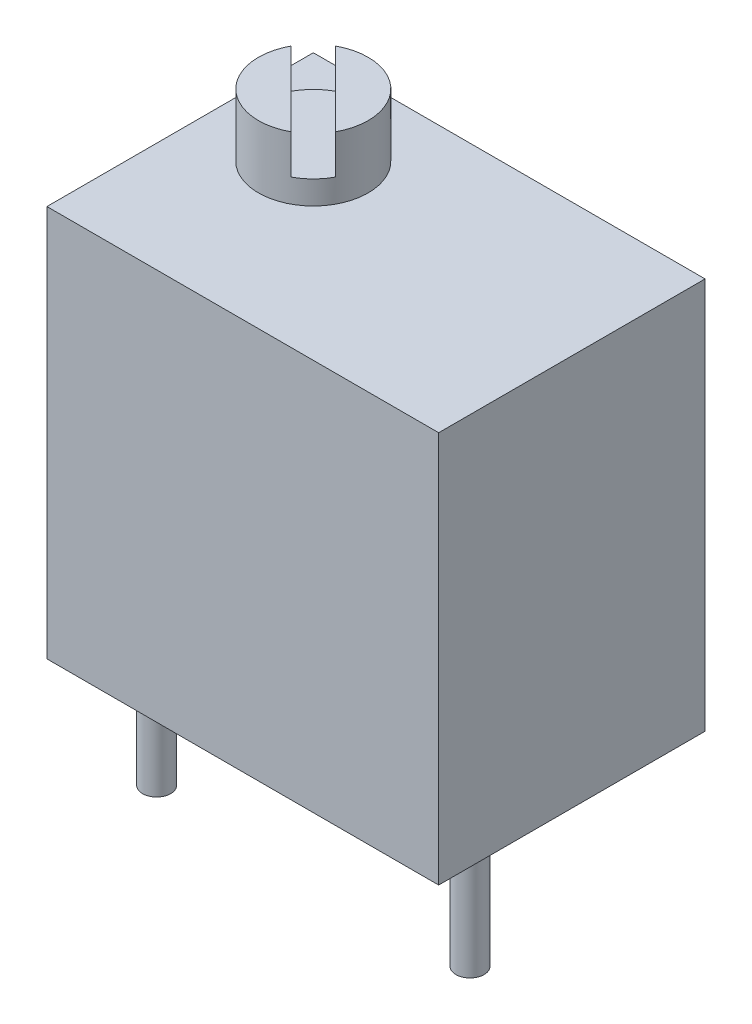
ISO-10303-21;
HEADER;
FILE_DESCRIPTION(('STEP AP214'),'2;1');
FILE_NAME('part.step','',(''),(''),'','','');
FILE_SCHEMA(('AUTOMOTIVE_DESIGN { 1 0 10303 214 1 1 1 1 }'));
ENDSEC;
DATA;
#1=APPLICATION_CONTEXT('core data for automotive mechanical design processes');
#2=APPLICATION_PROTOCOL_DEFINITION('international standard','automotive_design',2000,#1);
#3=PRODUCT_CONTEXT('',#1,'mechanical');
#4=PRODUCT('Part','Part','',(#3));
#5=PRODUCT_RELATED_PRODUCT_CATEGORY('part','',(#4));
#6=PRODUCT_DEFINITION_FORMATION('','',#4);
#7=PRODUCT_DEFINITION_CONTEXT('part definition',#1,'design');
#8=PRODUCT_DEFINITION('design','',#6,#7);
#9=PRODUCT_DEFINITION_SHAPE('','',#8);
#10=(LENGTH_UNIT() NAMED_UNIT(*) SI_UNIT(.MILLI.,.METRE.));
#11=(NAMED_UNIT(*) PLANE_ANGLE_UNIT() SI_UNIT($,.RADIAN.));
#12=(NAMED_UNIT(*) SI_UNIT($,.STERADIAN.) SOLID_ANGLE_UNIT());
#13=UNCERTAINTY_MEASURE_WITH_UNIT(LENGTH_MEASURE(1.E-05),#10,'distance_accuracy_value','');
#14=(GEOMETRIC_REPRESENTATION_CONTEXT(3) GLOBAL_UNCERTAINTY_ASSIGNED_CONTEXT((#13)) GLOBAL_UNIT_ASSIGNED_CONTEXT((#10,
#11,#12)) REPRESENTATION_CONTEXT('',''));
#15=CARTESIAN_POINT('',(0.,0.,0.));
#16=DIRECTION('',(0.,0.,1.));
#17=DIRECTION('',(1.,0.,0.));
#18=AXIS2_PLACEMENT_3D('',#15,#16,#17);
#19=CARTESIAN_POINT('',(-0.762,0.,-3.302));
#20=DIRECTION('',(0.,-1.,0.));
#21=DIRECTION('',(0.,0.,-1.));
#22=AXIS2_PLACEMENT_3D('',#19,#20,#21);
#23=PLANE('',#22);
#24=CARTESIAN_POINT('',(5.08,0.,0.));
#25=DIRECTION('',(0.,-1.,0.));
#26=DIRECTION('',(0.,0.,-1.));
#27=AXIS2_PLACEMENT_3D('',#24,#25,#26);
#28=CIRCLE('',#27,0.2286);
#29=CARTESIAN_POINT('',(5.08,0.,-0.2286));
#30=VERTEX_POINT('',#29);
#31=EDGE_CURVE('E170',#30,#30,#28,.T.);
#32=ORIENTED_EDGE('',*,*,#31,.F.);
#33=EDGE_LOOP('',(#32));
#34=FACE_BOUND('',#33,.T.);
#35=DIRECTION('',(0.,0.,1.));
#36=VECTOR('',#35,1.);
#37=CARTESIAN_POINT('',(-0.762,0.,1.016));
#38=LINE('',#37,#36);
#39=CARTESIAN_POINT('',(-0.762,0.,-3.302));
#40=VERTEX_POINT('',#39);
#41=CARTESIAN_POINT('',(-0.762,0.,1.016));
#42=VERTEX_POINT('',#41);
#43=EDGE_CURVE('E130',#40,#42,#38,.T.);
#44=ORIENTED_EDGE('',*,*,#43,.F.);
#45=DIRECTION('',(-1.,0.,0.));
#46=VECTOR('',#45,1.);
#47=CARTESIAN_POINT('',(-0.762,0.,-3.302));
#48=LINE('',#47,#46);
#49=CARTESIAN_POINT('',(5.588,0.,-3.302));
#50=VERTEX_POINT('',#49);
#51=EDGE_CURVE('E78',#50,#40,#48,.T.);
#52=ORIENTED_EDGE('',*,*,#51,.F.);
#53=DIRECTION('',(0.,0.,-1.));
#54=VECTOR('',#53,1.);
#55=CARTESIAN_POINT('',(5.588,0.,1.016));
#56=LINE('',#55,#54);
#57=CARTESIAN_POINT('',(5.588,0.,1.016));
#58=VERTEX_POINT('',#57);
#59=EDGE_CURVE('E146',#58,#50,#56,.T.);
#60=ORIENTED_EDGE('',*,*,#59,.F.);
#61=DIRECTION('',(1.,0.,0.));
#62=VECTOR('',#61,1.);
#63=CARTESIAN_POINT('',(-0.762,0.,1.016));
#64=LINE('',#63,#62);
#65=EDGE_CURVE('E144',#42,#58,#64,.T.);
#66=ORIENTED_EDGE('',*,*,#65,.F.);
#67=EDGE_LOOP('',(#44,#52,#60,#66));
#68=FACE_BOUND('',#67,.T.);
#69=CARTESIAN_POINT('',(0.,0.,0.));
#70=DIRECTION('',(0.,-1.,0.));
#71=DIRECTION('',(0.,0.,-1.));
#72=AXIS2_PLACEMENT_3D('',#69,#70,#71);
#73=CIRCLE('',#72,0.2286);
#74=CARTESIAN_POINT('',(0.,0.,-0.2286));
#75=VERTEX_POINT('',#74);
#76=EDGE_CURVE('E166',#75,#75,#73,.T.);
#77=ORIENTED_EDGE('',*,*,#76,.F.);
#78=EDGE_LOOP('',(#77));
#79=FACE_BOUND('',#78,.T.);
#80=CARTESIAN_POINT('',(2.54,0.,-2.54));
#81=DIRECTION('',(0.,-1.,0.));
#82=DIRECTION('',(0.,0.,-1.));
#83=AXIS2_PLACEMENT_3D('',#80,#81,#82);
#84=CIRCLE('',#83,0.2286);
#85=CARTESIAN_POINT('',(2.54,0.,-2.7686));
#86=VERTEX_POINT('',#85);
#87=EDGE_CURVE('E176',#86,#86,#84,.T.);
#88=ORIENTED_EDGE('',*,*,#87,.F.);
#89=EDGE_LOOP('',(#88));
#90=FACE_BOUND('',#89,.T.);
#91=ADVANCED_FACE('F32',(#34,#68,#79,#90),#23,.T.);
#92=CARTESIAN_POINT('',(0.762,7.366,-1.778));
#93=DIRECTION('',(0.,1.,0.));
#94=DIRECTION('',(0.,0.,1.));
#95=AXIS2_PLACEMENT_3D('',#92,#93,#94);
#96=PLANE('',#95);
#97=DIRECTION('',(-0.707106781186549,0.,-0.707106781186546));
#98=VECTOR('',#97,1.);
#99=CARTESIAN_POINT('',(0.941605122421383,7.366,-1.95760512242138));
#100=LINE('',#99,#98);
#101=CARTESIAN_POINT('',(1.54401901668346,7.366,-1.35519122815931));
#102=VERTEX_POINT('',#101);
#103=CARTESIAN_POINT('',(0.339191228159305,7.366,-2.56001901668346));
#104=VERTEX_POINT('',#103);
#105=EDGE_CURVE('E114',#102,#104,#100,.T.);
#106=ORIENTED_EDGE('',*,*,#105,.F.);
#107=CARTESIAN_POINT('',(0.762,7.366,-1.778));
#108=DIRECTION('',(0.,1.,0.));
#109=DIRECTION('',(0.,0.,1.));
#110=AXIS2_PLACEMENT_3D('',#107,#108,#109);
#111=CIRCLE('',#110,0.889);
#112=EDGE_CURVE('E126',#102,#104,#111,.T.);
#113=ORIENTED_EDGE('',*,*,#112,.T.);
#114=EDGE_LOOP('',(#106,#113));
#115=FACE_BOUND('',#114,.T.);
#116=ADVANCED_FACE('F207',(#115),#96,.T.);
#117=CARTESIAN_POINT('',(-0.762,6.35,-3.302));
#118=DIRECTION('',(0.,-1.,0.));
#119=DIRECTION('',(0.,0.,-1.));
#120=AXIS2_PLACEMENT_3D('',#117,#118,#119);
#121=PLANE('',#120);
#122=DIRECTION('',(0.,0.,1.));
#123=VECTOR('',#122,1.);
#124=CARTESIAN_POINT('',(-0.762,6.35,1.016));
#125=LINE('',#124,#123);
#126=CARTESIAN_POINT('',(-0.762,6.35,-3.302));
#127=VERTEX_POINT('',#126);
#128=CARTESIAN_POINT('',(-0.762,6.35,1.016));
#129=VERTEX_POINT('',#128);
#130=EDGE_CURVE('E135',#127,#129,#125,.T.);
#131=ORIENTED_EDGE('',*,*,#130,.T.);
#132=DIRECTION('',(1.,0.,0.));
#133=VECTOR('',#132,1.);
#134=CARTESIAN_POINT('',(-0.762,6.35,1.016));
#135=LINE('',#134,#133);
#136=CARTESIAN_POINT('',(5.588,6.35,1.016));
#137=VERTEX_POINT('',#136);
#138=EDGE_CURVE('E86',#129,#137,#135,.T.);
#139=ORIENTED_EDGE('',*,*,#138,.T.);
#140=DIRECTION('',(0.,0.,-1.));
#141=VECTOR('',#140,1.);
#142=CARTESIAN_POINT('',(5.588,6.35,1.016));
#143=LINE('',#142,#141);
#144=CARTESIAN_POINT('',(5.588,6.35,-3.302));
#145=VERTEX_POINT('',#144);
#146=EDGE_CURVE('E138',#137,#145,#143,.T.);
#147=ORIENTED_EDGE('',*,*,#146,.T.);
#148=DIRECTION('',(-1.,0.,0.));
#149=VECTOR('',#148,1.);
#150=CARTESIAN_POINT('',(-0.762,6.35,-3.302));
#151=LINE('',#150,#149);
#152=EDGE_CURVE('E57',#145,#127,#151,.T.);
#153=ORIENTED_EDGE('',*,*,#152,.T.);
#154=EDGE_LOOP('',(#131,#139,#147,#153));
#155=FACE_BOUND('',#154,.T.);
#156=CARTESIAN_POINT('',(0.762,6.35,-1.778));
#157=DIRECTION('',(0.,-1.,0.));
#158=DIRECTION('',(0.,0.,-1.));
#159=AXIS2_PLACEMENT_3D('',#156,#157,#158);
#160=CIRCLE('',#159,0.889);
#161=CARTESIAN_POINT('',(0.762,6.35,-2.667));
#162=VERTEX_POINT('',#161);
#163=EDGE_CURVE('E115',#162,#162,#160,.F.);
#164=ORIENTED_EDGE('',*,*,#163,.F.);
#165=EDGE_LOOP('',(#164));
#166=FACE_BOUND('',#165,.T.);
#167=ADVANCED_FACE('F213',(#155,#166),#121,.F.);
#168=CARTESIAN_POINT('',(-0.762,6.35,1.016));
#169=DIRECTION('',(1.,0.,0.));
#170=DIRECTION('',(0.,0.,-1.));
#171=AXIS2_PLACEMENT_3D('',#168,#169,#170);
#172=PLANE('',#171);
#173=ORIENTED_EDGE('',*,*,#43,.T.);
#174=DIRECTION('',(0.,-1.,0.));
#175=VECTOR('',#174,1.);
#176=CARTESIAN_POINT('',(-0.762,6.35,1.016));
#177=LINE('',#176,#175);
#178=EDGE_CURVE('E155',#129,#42,#177,.T.);
#179=ORIENTED_EDGE('',*,*,#178,.F.);
#180=ORIENTED_EDGE('',*,*,#130,.F.);
#181=DIRECTION('',(0.,-1.,0.));
#182=VECTOR('',#181,1.);
#183=CARTESIAN_POINT('',(-0.762,6.35,-3.302));
#184=LINE('',#183,#182);
#185=EDGE_CURVE('E141',#127,#40,#184,.T.);
#186=ORIENTED_EDGE('',*,*,#185,.T.);
#187=EDGE_LOOP('',(#173,#179,#180,#186));
#188=FACE_BOUND('',#187,.T.);
#189=ADVANCED_FACE('F34',(#188),#172,.F.);
#190=CARTESIAN_POINT('',(-0.762,6.35,1.016));
#191=DIRECTION('',(0.,0.,-1.));
#192=DIRECTION('',(-1.,0.,0.));
#193=AXIS2_PLACEMENT_3D('',#190,#191,#192);
#194=PLANE('',#193);
#195=ORIENTED_EDGE('',*,*,#65,.T.);
#196=DIRECTION('',(0.,-1.,0.));
#197=VECTOR('',#196,1.);
#198=CARTESIAN_POINT('',(5.588,6.35,1.016));
#199=LINE('',#198,#197);
#200=EDGE_CURVE('E152',#137,#58,#199,.T.);
#201=ORIENTED_EDGE('',*,*,#200,.F.);
#202=ORIENTED_EDGE('',*,*,#138,.F.);
#203=ORIENTED_EDGE('',*,*,#178,.T.);
#204=EDGE_LOOP('',(#195,#201,#202,#203));
#205=FACE_BOUND('',#204,.T.);
#206=ADVANCED_FACE('F226',(#205),#194,.F.);
#207=CARTESIAN_POINT('',(5.588,6.35,1.016));
#208=DIRECTION('',(-1.,0.,0.));
#209=DIRECTION('',(0.,0.,1.));
#210=AXIS2_PLACEMENT_3D('',#207,#208,#209);
#211=PLANE('',#210);
#212=ORIENTED_EDGE('',*,*,#59,.T.);
#213=DIRECTION('',(0.,-1.,0.));
#214=VECTOR('',#213,1.);
#215=CARTESIAN_POINT('',(5.588,6.35,-3.302));
#216=LINE('',#215,#214);
#217=EDGE_CURVE('E150',#145,#50,#216,.T.);
#218=ORIENTED_EDGE('',*,*,#217,.F.);
#219=ORIENTED_EDGE('',*,*,#146,.F.);
#220=ORIENTED_EDGE('',*,*,#200,.T.);
#221=EDGE_LOOP('',(#212,#218,#219,#220));
#222=FACE_BOUND('',#221,.T.);
#223=ADVANCED_FACE('F224',(#222),#211,.F.);
#224=CARTESIAN_POINT('',(-0.762,6.35,-3.302));
#225=DIRECTION('',(0.,0.,1.));
#226=DIRECTION('',(1.,0.,0.));
#227=AXIS2_PLACEMENT_3D('',#224,#225,#226);
#228=PLANE('',#227);
#229=ORIENTED_EDGE('',*,*,#51,.T.);
#230=ORIENTED_EDGE('',*,*,#185,.F.);
#231=ORIENTED_EDGE('',*,*,#152,.F.);
#232=ORIENTED_EDGE('',*,*,#217,.T.);
#233=EDGE_LOOP('',(#229,#230,#231,#232));
#234=FACE_BOUND('',#233,.T.);
#235=ADVANCED_FACE('F221',(#234),#228,.F.);
#236=CARTESIAN_POINT('',(0.762,7.366,-1.778));
#237=DIRECTION('',(0.,-1.,0.));
#238=DIRECTION('',(0.,0.,-1.));
#239=AXIS2_PLACEMENT_3D('',#236,#237,#238);
#240=CYLINDRICAL_SURFACE('',#239,0.889);
#241=ORIENTED_EDGE('',*,*,#112,.F.);
#242=DIRECTION('',(0.,-1.,0.));
#243=VECTOR('',#242,1.);
#244=CARTESIAN_POINT('',(1.54401901668346,7.366,-1.35519122815931));
#245=LINE('',#244,#243);
#246=CARTESIAN_POINT('',(1.54401901668346,6.731,-1.35519122815931));
#247=VERTEX_POINT('',#246);
#248=EDGE_CURVE('E127',#102,#247,#245,.T.);
#249=ORIENTED_EDGE('',*,*,#248,.T.);
#250=CARTESIAN_POINT('',(0.762,6.731,-1.778));
#251=DIRECTION('',(0.,-1.,0.));
#252=DIRECTION('',(0.,0.,-1.));
#253=AXIS2_PLACEMENT_3D('',#250,#251,#252);
#254=CIRCLE('',#253,0.889);
#255=CARTESIAN_POINT('',(1.18480877184069,6.731,-0.995980983316542));
#256=VERTEX_POINT('',#255);
#257=EDGE_CURVE('E11',#247,#256,#254,.T.);
#258=ORIENTED_EDGE('',*,*,#257,.T.);
#259=DIRECTION('',(0.,-1.,0.));
#260=VECTOR('',#259,1.);
#261=CARTESIAN_POINT('',(1.18480877184069,7.366,-0.995980983316542));
#262=LINE('',#261,#260);
#263=CARTESIAN_POINT('',(1.18480877184069,7.366,-0.995980983316542));
#264=VERTEX_POINT('',#263);
#265=EDGE_CURVE('E109',#256,#264,#262,.F.);
#266=ORIENTED_EDGE('',*,*,#265,.T.);
#267=CARTESIAN_POINT('',(-0.0200190166834602,7.366,-2.20080877184069));
#268=VERTEX_POINT('',#267);
#269=EDGE_CURVE('E121',#268,#264,#111,.T.);
#270=ORIENTED_EDGE('',*,*,#269,.F.);
#271=DIRECTION('',(0.,-1.,0.));
#272=VECTOR('',#271,1.);
#273=CARTESIAN_POINT('',(-0.0200190166834604,7.366,-2.20080877184069));
#274=LINE('',#273,#272);
#275=CARTESIAN_POINT('',(-0.0200190166834601,6.731,-2.20080877184069));
#276=VERTEX_POINT('',#275);
#277=EDGE_CURVE('E48',#268,#276,#274,.T.);
#278=ORIENTED_EDGE('',*,*,#277,.T.);
#279=CARTESIAN_POINT('',(0.339191228159306,6.731,-2.56001901668346));
#280=VERTEX_POINT('',#279);
#281=EDGE_CURVE('E41',#276,#280,#254,.T.);
#282=ORIENTED_EDGE('',*,*,#281,.T.);
#283=DIRECTION('',(0.,-1.,0.));
#284=VECTOR('',#283,1.);
#285=CARTESIAN_POINT('',(0.339191228159305,7.366,-2.56001901668346));
#286=LINE('',#285,#284);
#287=EDGE_CURVE('E131',#280,#104,#286,.F.);
#288=ORIENTED_EDGE('',*,*,#287,.T.);
#289=EDGE_LOOP('',(#241,#249,#258,#266,#270,#278,#282,#288));
#290=FACE_BOUND('',#289,.T.);
#291=ORIENTED_EDGE('',*,*,#163,.T.);
#292=EDGE_LOOP('',(#291));
#293=FACE_BOUND('',#292,.T.);
#294=ADVANCED_FACE('F119',(#290,#293),#240,.T.);
#295=DIRECTION('',(0.707106781186549,0.,0.707106781186546));
#296=VECTOR('',#295,1.);
#297=CARTESIAN_POINT('',(0.582394877578617,7.366,-1.59839487757862));
#298=LINE('',#297,#296);
#299=EDGE_CURVE('E106',#268,#264,#298,.T.);
#300=ORIENTED_EDGE('',*,*,#299,.F.);
#301=ORIENTED_EDGE('',*,*,#269,.T.);
#302=EDGE_LOOP('',(#300,#301));
#303=FACE_BOUND('',#302,.T.);
#304=ADVANCED_FACE('F125',(#303),#96,.T.);
#305=CARTESIAN_POINT('',(0.213873874089344,6.731,-2.68533637075342));
#306=DIRECTION('',(0.,-1.,0.));
#307=DIRECTION('',(0.,0.,-1.));
#308=AXIS2_PLACEMENT_3D('',#305,#306,#307);
#309=PLANE('',#308);
#310=DIRECTION('',(-0.707106781186549,0.,-0.707106781186546));
#311=VECTOR('',#310,1.);
#312=CARTESIAN_POINT('',(0.213873874089344,6.731,-2.68533637075342));
#313=LINE('',#312,#311);
#314=EDGE_CURVE('E123',#247,#280,#313,.T.);
#315=ORIENTED_EDGE('',*,*,#314,.T.);
#316=ORIENTED_EDGE('',*,*,#281,.F.);
#317=DIRECTION('',(0.707106781186549,0.,0.707106781186546));
#318=VECTOR('',#317,1.);
#319=CARTESIAN_POINT('',(-0.145336370753422,6.731,-2.32612612591065));
#320=LINE('',#319,#318);
#321=EDGE_CURVE('E164',#276,#256,#320,.T.);
#322=ORIENTED_EDGE('',*,*,#321,.T.);
#323=ORIENTED_EDGE('',*,*,#257,.F.);
#324=EDGE_LOOP('',(#315,#316,#322,#323));
#325=FACE_BOUND('',#324,.T.);
#326=ADVANCED_FACE('F163',(#325),#309,.F.);
#327=CARTESIAN_POINT('',(0.213873874089344,6.731,-2.68533637075342));
#328=DIRECTION('',(0.707106781186546,0.,-0.707106781186549));
#329=DIRECTION('',(-0.707106781186549,0.,-0.707106781186546));
#330=AXIS2_PLACEMENT_3D('',#327,#328,#329);
#331=PLANE('',#330);
#332=ORIENTED_EDGE('',*,*,#105,.T.);
#333=ORIENTED_EDGE('',*,*,#287,.F.);
#334=ORIENTED_EDGE('',*,*,#314,.F.);
#335=ORIENTED_EDGE('',*,*,#248,.F.);
#336=EDGE_LOOP('',(#332,#333,#334,#335));
#337=FACE_BOUND('',#336,.T.);
#338=ADVANCED_FACE('F251',(#337),#331,.F.);
#339=CARTESIAN_POINT('',(-0.145336370753422,6.731,-2.32612612591065));
#340=DIRECTION('',(-0.707106781186546,0.,0.707106781186549));
#341=DIRECTION('',(0.707106781186549,0.,0.707106781186546));
#342=AXIS2_PLACEMENT_3D('',#339,#340,#341);
#343=PLANE('',#342);
#344=ORIENTED_EDGE('',*,*,#299,.T.);
#345=ORIENTED_EDGE('',*,*,#265,.F.);
#346=ORIENTED_EDGE('',*,*,#321,.F.);
#347=ORIENTED_EDGE('',*,*,#277,.F.);
#348=EDGE_LOOP('',(#344,#345,#346,#347));
#349=FACE_BOUND('',#348,.T.);
#350=ADVANCED_FACE('F108',(#349),#343,.F.);
#351=CARTESIAN_POINT('',(0.,-4.7752,0.));
#352=DIRECTION('',(0.,1.,0.));
#353=DIRECTION('',(0.,0.,1.));
#354=AXIS2_PLACEMENT_3D('',#351,#352,#353);
#355=CYLINDRICAL_SURFACE('',#354,0.2286);
#356=CARTESIAN_POINT('',(0.,-1.905,0.));
#357=DIRECTION('',(0.,1.,0.));
#358=DIRECTION('',(0.,0.,1.));
#359=AXIS2_PLACEMENT_3D('',#356,#357,#358);
#360=CIRCLE('',#359,0.2286);
#361=CARTESIAN_POINT('',(0.,-1.905,0.2286));
#362=VERTEX_POINT('',#361);
#363=EDGE_CURVE('E179',#362,#362,#360,.T.);
#364=ORIENTED_EDGE('',*,*,#363,.T.);
#365=EDGE_LOOP('',(#364));
#366=FACE_BOUND('',#365,.T.);
#367=ORIENTED_EDGE('',*,*,#76,.T.);
#368=EDGE_LOOP('',(#367));
#369=FACE_BOUND('',#368,.T.);
#370=ADVANCED_FACE('F250',(#366,#369),#355,.T.);
#371=CARTESIAN_POINT('',(5.08,-4.7752,0.));
#372=DIRECTION('',(0.,1.,0.));
#373=DIRECTION('',(0.,0.,1.));
#374=AXIS2_PLACEMENT_3D('',#371,#372,#373);
#375=CYLINDRICAL_SURFACE('',#374,0.2286);
#376=CARTESIAN_POINT('',(5.08,-1.905,0.));
#377=DIRECTION('',(0.,1.,0.));
#378=DIRECTION('',(0.,0.,1.));
#379=AXIS2_PLACEMENT_3D('',#376,#377,#378);
#380=CIRCLE('',#379,0.2286);
#381=CARTESIAN_POINT('',(5.08,-1.905,0.2286));
#382=VERTEX_POINT('',#381);
#383=EDGE_CURVE('E182',#382,#382,#380,.T.);
#384=ORIENTED_EDGE('',*,*,#383,.T.);
#385=EDGE_LOOP('',(#384));
#386=FACE_BOUND('',#385,.T.);
#387=ORIENTED_EDGE('',*,*,#31,.T.);
#388=EDGE_LOOP('',(#387));
#389=FACE_BOUND('',#388,.T.);
#390=ADVANCED_FACE('F202',(#386,#389),#375,.T.);
#391=CARTESIAN_POINT('',(2.54,-4.7752,-2.54));
#392=DIRECTION('',(0.,1.,0.));
#393=DIRECTION('',(0.,0.,1.));
#394=AXIS2_PLACEMENT_3D('',#391,#392,#393);
#395=CYLINDRICAL_SURFACE('',#394,0.2286);
#396=CARTESIAN_POINT('',(2.54,-1.905,-2.54));
#397=DIRECTION('',(0.,1.,0.));
#398=DIRECTION('',(0.,0.,1.));
#399=AXIS2_PLACEMENT_3D('',#396,#397,#398);
#400=CIRCLE('',#399,0.2286);
#401=CARTESIAN_POINT('',(2.54,-1.905,-2.3114));
#402=VERTEX_POINT('',#401);
#403=EDGE_CURVE('E36',#402,#402,#400,.T.);
#404=ORIENTED_EDGE('',*,*,#403,.T.);
#405=EDGE_LOOP('',(#404));
#406=FACE_BOUND('',#405,.T.);
#407=ORIENTED_EDGE('',*,*,#87,.T.);
#408=EDGE_LOOP('',(#407));
#409=FACE_BOUND('',#408,.T.);
#410=ADVANCED_FACE('F189',(#406,#409),#395,.T.);
#411=CARTESIAN_POINT('',(-0.2286,-1.905,-3.302));
#412=DIRECTION('',(0.,1.,0.));
#413=DIRECTION('',(0.,0.,1.));
#414=AXIS2_PLACEMENT_3D('',#411,#412,#413);
#415=PLANE('',#414);
#416=ORIENTED_EDGE('',*,*,#403,.F.);
#417=EDGE_LOOP('',(#416));
#418=FACE_BOUND('',#417,.T.);
#419=ADVANCED_FACE('F192',(#418),#415,.F.);
#420=ORIENTED_EDGE('',*,*,#383,.F.);
#421=EDGE_LOOP('',(#420));
#422=FACE_BOUND('',#421,.T.);
#423=ADVANCED_FACE('F194',(#422),#415,.F.);
#424=ORIENTED_EDGE('',*,*,#363,.F.);
#425=EDGE_LOOP('',(#424));
#426=FACE_BOUND('',#425,.T.);
#427=ADVANCED_FACE('F196',(#426),#415,.F.);
#428=CLOSED_SHELL('',(#91,#116,#167,#189,#206,#223,#235,#294,#304,#326,#338,#350,#370,#390,#410,
#419,#423,#427));
#429=MANIFOLD_SOLID_BREP('B2',#428);
#430=ADVANCED_BREP_SHAPE_REPRESENTATION('',(#18,#429),#14);
#431=SHAPE_DEFINITION_REPRESENTATION(#9,#430);
ENDSEC;
END-ISO-10303-21;
